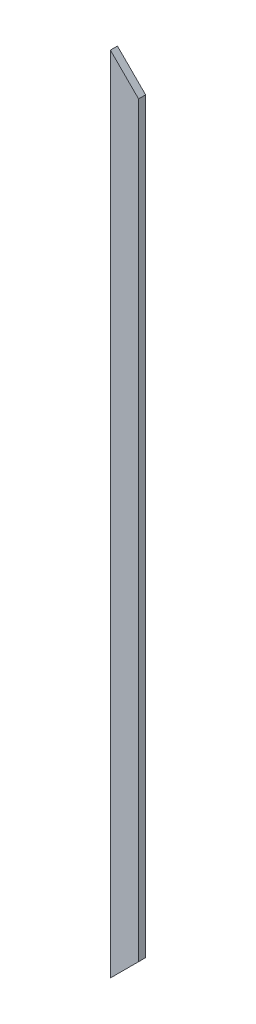
ISO-10303-21;
HEADER;
FILE_DESCRIPTION(('STEP AP214'),'2;1');
FILE_NAME('part.step','',(''),(''),'','','');
FILE_SCHEMA(('AUTOMOTIVE_DESIGN { 1 0 10303 214 1 1 1 1 }'));
ENDSEC;
DATA;
#1=APPLICATION_CONTEXT('core data for automotive mechanical design processes');
#2=APPLICATION_PROTOCOL_DEFINITION('international standard','automotive_design',2000,#1);
#3=PRODUCT_CONTEXT('',#1,'mechanical');
#4=PRODUCT('Part','Part','',(#3));
#5=PRODUCT_RELATED_PRODUCT_CATEGORY('part','',(#4));
#6=PRODUCT_DEFINITION_FORMATION('','',#4);
#7=PRODUCT_DEFINITION_CONTEXT('part definition',#1,'design');
#8=PRODUCT_DEFINITION('design','',#6,#7);
#9=PRODUCT_DEFINITION_SHAPE('','',#8);
#10=(LENGTH_UNIT() NAMED_UNIT(*) SI_UNIT(.MILLI.,.METRE.));
#11=(NAMED_UNIT(*) PLANE_ANGLE_UNIT() SI_UNIT($,.RADIAN.));
#12=(NAMED_UNIT(*) SI_UNIT($,.STERADIAN.) SOLID_ANGLE_UNIT());
#13=UNCERTAINTY_MEASURE_WITH_UNIT(LENGTH_MEASURE(1.E-05),#10,'distance_accuracy_value','');
#14=(GEOMETRIC_REPRESENTATION_CONTEXT(3) GLOBAL_UNCERTAINTY_ASSIGNED_CONTEXT((#13)) GLOBAL_UNIT_ASSIGNED_CONTEXT((#10,
#11,#12)) REPRESENTATION_CONTEXT('',''));
#15=CARTESIAN_POINT('',(0.,0.,0.));
#16=DIRECTION('',(0.,0.,1.));
#17=DIRECTION('',(1.,0.,0.));
#18=AXIS2_PLACEMENT_3D('',#15,#16,#17);
#19=CARTESIAN_POINT('',(-10.,0.,5.));
#20=DIRECTION('',(1.,0.,0.));
#21=DIRECTION('',(0.,1.,0.));
#22=AXIS2_PLACEMENT_3D('',#19,#20,#21);
#23=PLANE('',#22);
#24=DIRECTION('',(0.,-1.,0.));
#25=VECTOR('',#24,1.);
#26=CARTESIAN_POINT('',(-10.,0.,0.));
#27=LINE('',#26,#25);
#28=CARTESIAN_POINT('',(-9.99999999999997,285.,0.));
#29=VERTEX_POINT('',#28);
#30=CARTESIAN_POINT('',(-9.99999999999997,-285.,0.));
#31=VERTEX_POINT('',#30);
#32=EDGE_CURVE('E83',#29,#31,#27,.T.);
#33=ORIENTED_EDGE('',*,*,#32,.T.);
#34=DIRECTION('',(0.,0.,-1.));
#35=VECTOR('',#34,1.);
#36=CARTESIAN_POINT('',(-9.99999999999997,-285.,5.));
#37=LINE('',#36,#35);
#38=CARTESIAN_POINT('',(-9.99999999999997,-285.,5.));
#39=VERTEX_POINT('',#38);
#40=EDGE_CURVE('E11',#39,#31,#37,.T.);
#41=ORIENTED_EDGE('',*,*,#40,.F.);
#42=DIRECTION('',(0.,-1.,0.));
#43=VECTOR('',#42,1.);
#44=CARTESIAN_POINT('',(-10.,0.,5.));
#45=LINE('',#44,#43);
#46=CARTESIAN_POINT('',(-9.99999999999997,285.,5.));
#47=VERTEX_POINT('',#46);
#48=EDGE_CURVE('E75',#47,#39,#45,.T.);
#49=ORIENTED_EDGE('',*,*,#48,.F.);
#50=DIRECTION('',(0.,0.,-1.));
#51=VECTOR('',#50,1.);
#52=CARTESIAN_POINT('',(-9.99999999999997,285.,5.));
#53=LINE('',#52,#51);
#54=EDGE_CURVE('E92',#47,#29,#53,.T.);
#55=ORIENTED_EDGE('',*,*,#54,.T.);
#56=EDGE_LOOP('',(#33,#41,#49,#55));
#57=FACE_BOUND('',#56,.T.);
#58=ADVANCED_FACE('F39',(#57),#23,.F.);
#59=CARTESIAN_POINT('',(10.,-265.,5.));
#60=DIRECTION('',(-0.707106781186551,0.707106781186544,0.));
#61=DIRECTION('',(-0.707106781186544,-0.707106781186551,0.));
#62=AXIS2_PLACEMENT_3D('',#59,#60,#61);
#63=PLANE('',#62);
#64=DIRECTION('',(0.707106781186544,0.70710678118655,0.));
#65=VECTOR('',#64,1.);
#66=CARTESIAN_POINT('',(10.,-265.,0.));
#67=LINE('',#66,#65);
#68=CARTESIAN_POINT('',(10.,-265.,0.));
#69=VERTEX_POINT('',#68);
#70=EDGE_CURVE('E67',#31,#69,#67,.T.);
#71=ORIENTED_EDGE('',*,*,#70,.T.);
#72=DIRECTION('',(0.,0.,-1.));
#73=VECTOR('',#72,1.);
#74=CARTESIAN_POINT('',(10.,-265.,5.));
#75=LINE('',#74,#73);
#76=CARTESIAN_POINT('',(10.,-265.,5.));
#77=VERTEX_POINT('',#76);
#78=EDGE_CURVE('E48',#77,#69,#75,.T.);
#79=ORIENTED_EDGE('',*,*,#78,.F.);
#80=DIRECTION('',(0.707106781186544,0.707106781186551,0.));
#81=VECTOR('',#80,1.);
#82=CARTESIAN_POINT('',(-9.99999999999997,-285.,5.));
#83=LINE('',#82,#81);
#84=EDGE_CURVE('E56',#39,#77,#83,.T.);
#85=ORIENTED_EDGE('',*,*,#84,.F.);
#86=ORIENTED_EDGE('',*,*,#40,.T.);
#87=EDGE_LOOP('',(#71,#79,#85,#86));
#88=FACE_BOUND('',#87,.T.);
#89=ADVANCED_FACE('F124',(#88),#63,.F.);
#90=CARTESIAN_POINT('',(9.99999999999999,0.,5.));
#91=DIRECTION('',(-1.,0.,0.));
#92=DIRECTION('',(0.,-1.,0.));
#93=AXIS2_PLACEMENT_3D('',#90,#91,#92);
#94=PLANE('',#93);
#95=DIRECTION('',(0.,1.,0.));
#96=VECTOR('',#95,1.);
#97=CARTESIAN_POINT('',(9.99999999999999,0.,0.));
#98=LINE('',#97,#96);
#99=CARTESIAN_POINT('',(10.,265.,0.));
#100=VERTEX_POINT('',#99);
#101=EDGE_CURVE('E109',#69,#100,#98,.T.);
#102=ORIENTED_EDGE('',*,*,#101,.T.);
#103=DIRECTION('',(0.,0.,-1.));
#104=VECTOR('',#103,1.);
#105=CARTESIAN_POINT('',(10.,265.,5.));
#106=LINE('',#105,#104);
#107=CARTESIAN_POINT('',(10.,265.,5.));
#108=VERTEX_POINT('',#107);
#109=EDGE_CURVE('E89',#108,#100,#106,.T.);
#110=ORIENTED_EDGE('',*,*,#109,.F.);
#111=DIRECTION('',(0.,1.,0.));
#112=VECTOR('',#111,1.);
#113=CARTESIAN_POINT('',(9.99999999999999,0.,5.));
#114=LINE('',#113,#112);
#115=EDGE_CURVE('E112',#77,#108,#114,.T.);
#116=ORIENTED_EDGE('',*,*,#115,.F.);
#117=ORIENTED_EDGE('',*,*,#78,.T.);
#118=EDGE_LOOP('',(#102,#110,#116,#117));
#119=FACE_BOUND('',#118,.T.);
#120=ADVANCED_FACE('F122',(#119),#94,.F.);
#121=CARTESIAN_POINT('',(0.,0.,5.));
#122=DIRECTION('',(0.,0.,1.));
#123=DIRECTION('',(1.,0.,0.));
#124=AXIS2_PLACEMENT_3D('',#121,#122,#123);
#125=PLANE('',#124);
#126=ORIENTED_EDGE('',*,*,#115,.T.);
#127=DIRECTION('',(0.707106781186544,-0.70710678118655,0.));
#128=VECTOR('',#127,1.);
#129=CARTESIAN_POINT('',(10.,265.,5.));
#130=LINE('',#129,#128);
#131=EDGE_CURVE('E96',#47,#108,#130,.T.);
#132=ORIENTED_EDGE('',*,*,#131,.F.);
#133=ORIENTED_EDGE('',*,*,#48,.T.);
#134=ORIENTED_EDGE('',*,*,#84,.T.);
#135=EDGE_LOOP('',(#126,#132,#133,#134));
#136=FACE_BOUND('',#135,.T.);
#137=ADVANCED_FACE('F130',(#136),#125,.T.);
#138=CARTESIAN_POINT('',(0.,0.,0.));
#139=DIRECTION('',(0.,0.,1.));
#140=DIRECTION('',(1.,0.,0.));
#141=AXIS2_PLACEMENT_3D('',#138,#139,#140);
#142=PLANE('',#141);
#143=ORIENTED_EDGE('',*,*,#32,.F.);
#144=DIRECTION('',(0.707106781186544,-0.707106781186551,0.));
#145=VECTOR('',#144,1.);
#146=CARTESIAN_POINT('',(-9.99999999999997,285.,0.));
#147=LINE('',#146,#145);
#148=EDGE_CURVE('E86',#29,#100,#147,.T.);
#149=ORIENTED_EDGE('',*,*,#148,.T.);
#150=ORIENTED_EDGE('',*,*,#101,.F.);
#151=ORIENTED_EDGE('',*,*,#70,.F.);
#152=EDGE_LOOP('',(#143,#149,#150,#151));
#153=FACE_BOUND('',#152,.T.);
#154=ADVANCED_FACE('F84',(#153),#142,.F.);
#155=CARTESIAN_POINT('',(-9.99999999999997,285.,5.));
#156=DIRECTION('',(0.707106781186551,0.707106781186544,0.));
#157=DIRECTION('',(-0.707106781186544,0.707106781186551,0.));
#158=AXIS2_PLACEMENT_3D('',#155,#156,#157);
#159=PLANE('',#158);
#160=ORIENTED_EDGE('',*,*,#148,.F.);
#161=ORIENTED_EDGE('',*,*,#54,.F.);
#162=ORIENTED_EDGE('',*,*,#131,.T.);
#163=ORIENTED_EDGE('',*,*,#109,.T.);
#164=EDGE_LOOP('',(#160,#161,#162,#163));
#165=FACE_BOUND('',#164,.T.);
#166=ADVANCED_FACE('F98',(#165),#159,.T.);
#167=CLOSED_SHELL('',(#58,#89,#120,#137,#154,#166));
#168=MANIFOLD_SOLID_BREP('B2',#167);
#169=ADVANCED_BREP_SHAPE_REPRESENTATION('',(#18,#168),#14);
#170=SHAPE_DEFINITION_REPRESENTATION(#9,#169);
ENDSEC;
END-ISO-10303-21;
